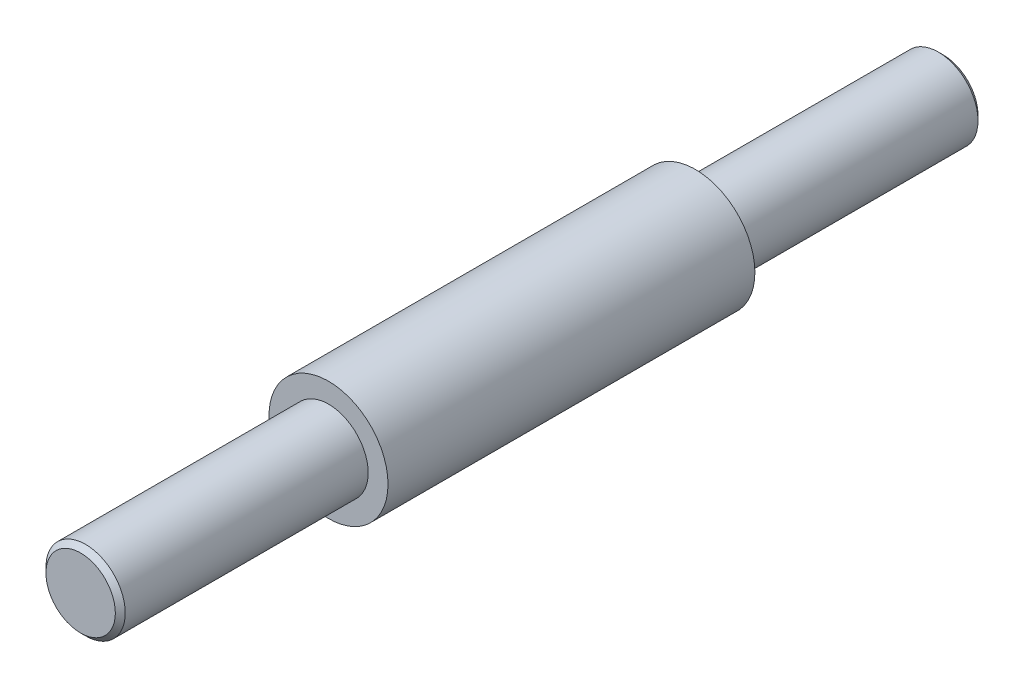
ISO-10303-21;
HEADER;
FILE_DESCRIPTION(('STEP AP214'),'2;1');
FILE_NAME('part.step','',(''),(''),'','','');
FILE_SCHEMA(('AUTOMOTIVE_DESIGN { 1 0 10303 214 1 1 1 1 }'));
ENDSEC;
DATA;
#1=APPLICATION_CONTEXT('core data for automotive mechanical design processes');
#2=APPLICATION_PROTOCOL_DEFINITION('international standard','automotive_design',2000,#1);
#3=PRODUCT_CONTEXT('',#1,'mechanical');
#4=PRODUCT('Part','Part','',(#3));
#5=PRODUCT_RELATED_PRODUCT_CATEGORY('part','',(#4));
#6=PRODUCT_DEFINITION_FORMATION('','',#4);
#7=PRODUCT_DEFINITION_CONTEXT('part definition',#1,'design');
#8=PRODUCT_DEFINITION('design','',#6,#7);
#9=PRODUCT_DEFINITION_SHAPE('','',#8);
#10=(LENGTH_UNIT() NAMED_UNIT(*) SI_UNIT(.MILLI.,.METRE.));
#11=(NAMED_UNIT(*) PLANE_ANGLE_UNIT() SI_UNIT($,.RADIAN.));
#12=(NAMED_UNIT(*) SI_UNIT($,.STERADIAN.) SOLID_ANGLE_UNIT());
#13=UNCERTAINTY_MEASURE_WITH_UNIT(LENGTH_MEASURE(1.E-05),#10,'distance_accuracy_value','');
#14=(GEOMETRIC_REPRESENTATION_CONTEXT(3) GLOBAL_UNCERTAINTY_ASSIGNED_CONTEXT((#13)) GLOBAL_UNIT_ASSIGNED_CONTEXT((#10,
#11,#12)) REPRESENTATION_CONTEXT('',''));
#15=CARTESIAN_POINT('',(0.,0.,0.));
#16=DIRECTION('',(0.,0.,1.));
#17=DIRECTION('',(1.,0.,0.));
#18=AXIS2_PLACEMENT_3D('',#15,#16,#17);
#19=CARTESIAN_POINT('',(0.,0.,0.));
#20=DIRECTION('',(0.,0.,1.));
#21=DIRECTION('',(1.,0.,0.));
#22=AXIS2_PLACEMENT_3D('',#19,#20,#21);
#23=PLANE('',#22);
#24=CARTESIAN_POINT('',(0.,0.,0.));
#25=DIRECTION('',(0.,0.,1.));
#26=DIRECTION('',(1.,0.,0.));
#27=AXIS2_PLACEMENT_3D('',#24,#25,#26);
#28=CIRCLE('',#27,6.);
#29=CARTESIAN_POINT('',(6.,0.,0.));
#30=VERTEX_POINT('',#29);
#31=EDGE_CURVE('E52',#30,#30,#28,.T.);
#32=ORIENTED_EDGE('',*,*,#31,.F.);
#33=EDGE_LOOP('',(#32));
#34=FACE_BOUND('',#33,.T.);
#35=CARTESIAN_POINT('',(0.,0.,0.));
#36=DIRECTION('',(0.,0.,1.));
#37=DIRECTION('',(1.,0.,0.));
#38=AXIS2_PLACEMENT_3D('',#35,#36,#37);
#39=CIRCLE('',#38,4.);
#40=CARTESIAN_POINT('',(4.,0.,0.));
#41=VERTEX_POINT('',#40);
#42=EDGE_CURVE('E48',#41,#41,#39,.F.);
#43=ORIENTED_EDGE('',*,*,#42,.F.);
#44=EDGE_LOOP('',(#43));
#45=FACE_BOUND('',#44,.T.);
#46=ADVANCED_FACE('F28',(#34,#45),#23,.F.);
#47=CARTESIAN_POINT('',(0.,0.,37.));
#48=DIRECTION('',(0.,0.,1.));
#49=DIRECTION('',(1.,0.,0.));
#50=AXIS2_PLACEMENT_3D('',#47,#48,#49);
#51=PLANE('',#50);
#52=CARTESIAN_POINT('',(0.,0.,37.));
#53=DIRECTION('',(0.,0.,1.));
#54=DIRECTION('',(1.,0.,0.));
#55=AXIS2_PLACEMENT_3D('',#52,#53,#54);
#56=CIRCLE('',#55,6.);
#57=CARTESIAN_POINT('',(6.,0.,37.));
#58=VERTEX_POINT('',#57);
#59=EDGE_CURVE('E51',#58,#58,#56,.T.);
#60=ORIENTED_EDGE('',*,*,#59,.T.);
#61=EDGE_LOOP('',(#60));
#62=FACE_BOUND('',#61,.T.);
#63=CARTESIAN_POINT('',(0.,0.,37.));
#64=DIRECTION('',(0.,0.,1.));
#65=DIRECTION('',(1.,0.,0.));
#66=AXIS2_PLACEMENT_3D('',#63,#64,#65);
#67=CIRCLE('',#66,4.);
#68=CARTESIAN_POINT('',(4.,0.,37.));
#69=VERTEX_POINT('',#68);
#70=EDGE_CURVE('E55',#69,#69,#67,.T.);
#71=ORIENTED_EDGE('',*,*,#70,.F.);
#72=EDGE_LOOP('',(#71));
#73=FACE_BOUND('',#72,.T.);
#74=ADVANCED_FACE('F63',(#62,#73),#51,.T.);
#75=CARTESIAN_POINT('',(0.,0.,37.));
#76=DIRECTION('',(0.,0.,-1.));
#77=DIRECTION('',(-1.,0.,0.));
#78=AXIS2_PLACEMENT_3D('',#75,#76,#77);
#79=CYLINDRICAL_SURFACE('',#78,6.);
#80=ORIENTED_EDGE('',*,*,#59,.F.);
#81=EDGE_LOOP('',(#80));
#82=FACE_BOUND('',#81,.T.);
#83=ORIENTED_EDGE('',*,*,#31,.T.);
#84=EDGE_LOOP('',(#83));
#85=FACE_BOUND('',#84,.T.);
#86=ADVANCED_FACE('F65',(#82,#85),#79,.T.);
#87=CARTESIAN_POINT('',(0.,0.,62.));
#88=DIRECTION('',(0.,0.,-1.));
#89=DIRECTION('',(-1.,0.,0.));
#90=AXIS2_PLACEMENT_3D('',#87,#88,#89);
#91=CYLINDRICAL_SURFACE('',#90,4.);
#92=CARTESIAN_POINT('',(0.,0.,61.5));
#93=DIRECTION('',(0.,0.,1.));
#94=DIRECTION('',(1.,0.,0.));
#95=AXIS2_PLACEMENT_3D('',#92,#93,#94);
#96=CIRCLE('',#95,4.);
#97=CARTESIAN_POINT('',(4.,0.,61.5));
#98=VERTEX_POINT('',#97);
#99=EDGE_CURVE('E10',#98,#98,#96,.F.);
#100=ORIENTED_EDGE('',*,*,#99,.T.);
#101=EDGE_LOOP('',(#100));
#102=FACE_BOUND('',#101,.T.);
#103=ORIENTED_EDGE('',*,*,#70,.T.);
#104=EDGE_LOOP('',(#103));
#105=FACE_BOUND('',#104,.T.);
#106=ADVANCED_FACE('F61',(#102,#105),#91,.T.);
#107=CARTESIAN_POINT('',(0.,0.,62.));
#108=DIRECTION('',(0.,0.,1.));
#109=DIRECTION('',(1.,0.,0.));
#110=AXIS2_PLACEMENT_3D('',#107,#108,#109);
#111=PLANE('',#110);
#112=CARTESIAN_POINT('',(0.,0.,62.));
#113=DIRECTION('',(0.,0.,1.));
#114=DIRECTION('',(1.,0.,0.));
#115=AXIS2_PLACEMENT_3D('',#112,#113,#114);
#116=CIRCLE('',#115,3.5);
#117=CARTESIAN_POINT('',(3.5,0.,62.));
#118=VERTEX_POINT('',#117);
#119=EDGE_CURVE('E35',#118,#118,#116,.T.);
#120=ORIENTED_EDGE('',*,*,#119,.T.);
#121=EDGE_LOOP('',(#120));
#122=FACE_BOUND('',#121,.T.);
#123=ADVANCED_FACE('F96',(#122),#111,.T.);
#124=CARTESIAN_POINT('',(0.,0.,-25.));
#125=DIRECTION('',(0.,0.,1.));
#126=DIRECTION('',(1.,0.,0.));
#127=AXIS2_PLACEMENT_3D('',#124,#125,#126);
#128=CYLINDRICAL_SURFACE('',#127,4.);
#129=CARTESIAN_POINT('',(0.,0.,-24.5));
#130=DIRECTION('',(0.,0.,-1.));
#131=DIRECTION('',(-1.,0.,0.));
#132=AXIS2_PLACEMENT_3D('',#129,#130,#131);
#133=CIRCLE('',#132,4.);
#134=CARTESIAN_POINT('',(-4.,0.,-24.5));
#135=VERTEX_POINT('',#134);
#136=EDGE_CURVE('E39',#135,#135,#133,.F.);
#137=ORIENTED_EDGE('',*,*,#136,.T.);
#138=EDGE_LOOP('',(#137));
#139=FACE_BOUND('',#138,.T.);
#140=ORIENTED_EDGE('',*,*,#42,.T.);
#141=EDGE_LOOP('',(#140));
#142=FACE_BOUND('',#141,.T.);
#143=ADVANCED_FACE('F87',(#139,#142),#128,.T.);
#144=CARTESIAN_POINT('',(0.,0.,-25.));
#145=DIRECTION('',(0.,0.,-1.));
#146=DIRECTION('',(-1.,0.,0.));
#147=AXIS2_PLACEMENT_3D('',#144,#145,#146);
#148=PLANE('',#147);
#149=CARTESIAN_POINT('',(0.,0.,-25.));
#150=DIRECTION('',(0.,0.,-1.));
#151=DIRECTION('',(-1.,0.,0.));
#152=AXIS2_PLACEMENT_3D('',#149,#150,#151);
#153=CIRCLE('',#152,3.5);
#154=CARTESIAN_POINT('',(-3.5,0.,-25.));
#155=VERTEX_POINT('',#154);
#156=EDGE_CURVE('E43',#155,#155,#153,.T.);
#157=ORIENTED_EDGE('',*,*,#156,.T.);
#158=EDGE_LOOP('',(#157));
#159=FACE_BOUND('',#158,.T.);
#160=ADVANCED_FACE('F80',(#159),#148,.T.);
#161=CARTESIAN_POINT('',(0.,0.,-25.));
#162=DIRECTION('',(0.,0.,1.));
#163=DIRECTION('',(1.,0.,0.));
#164=AXIS2_PLACEMENT_3D('',#161,#162,#163);
#165=CONICAL_SURFACE('',#164,3.5,0.785398163397448);
#166=ORIENTED_EDGE('',*,*,#136,.F.);
#167=EDGE_LOOP('',(#166));
#168=FACE_BOUND('',#167,.T.);
#169=ORIENTED_EDGE('',*,*,#156,.F.);
#170=EDGE_LOOP('',(#169));
#171=FACE_BOUND('',#170,.T.);
#172=ADVANCED_FACE('F78',(#168,#171),#165,.T.);
#173=CARTESIAN_POINT('',(0.,0.,62.));
#174=DIRECTION('',(0.,0.,-1.));
#175=DIRECTION('',(-1.,0.,0.));
#176=AXIS2_PLACEMENT_3D('',#173,#174,#175);
#177=CONICAL_SURFACE('',#176,3.5,0.785398163397452);
#178=ORIENTED_EDGE('',*,*,#99,.F.);
#179=EDGE_LOOP('',(#178));
#180=FACE_BOUND('',#179,.T.);
#181=ORIENTED_EDGE('',*,*,#119,.F.);
#182=EDGE_LOOP('',(#181));
#183=FACE_BOUND('',#182,.T.);
#184=ADVANCED_FACE('F30',(#180,#183),#177,.T.);
#185=CLOSED_SHELL('',(#46,#74,#86,#106,#123,#143,#160,#172,#184));
#186=MANIFOLD_SOLID_BREP('B2',#185);
#187=ADVANCED_BREP_SHAPE_REPRESENTATION('',(#18,#186),#14);
#188=SHAPE_DEFINITION_REPRESENTATION(#9,#187);
ENDSEC;
END-ISO-10303-21;
